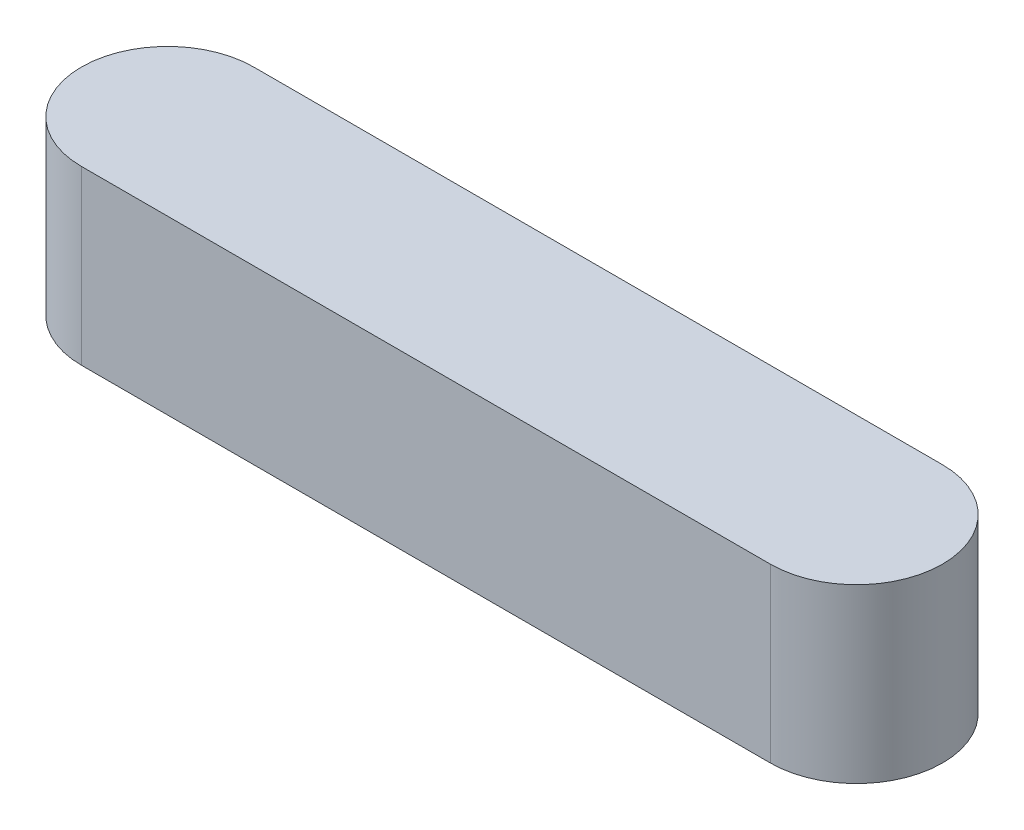
ISO-10303-21;
HEADER;
FILE_DESCRIPTION(('STEP AP214'),'2;1');
FILE_NAME('part.step','',(''),(''),'','','');
FILE_SCHEMA(('AUTOMOTIVE_DESIGN { 1 0 10303 214 1 1 1 1 }'));
ENDSEC;
DATA;
#1=APPLICATION_CONTEXT('core data for automotive mechanical design processes');
#2=APPLICATION_PROTOCOL_DEFINITION('international standard','automotive_design',2000,#1);
#3=PRODUCT_CONTEXT('',#1,'mechanical');
#4=PRODUCT('Part','Part','',(#3));
#5=PRODUCT_RELATED_PRODUCT_CATEGORY('part','',(#4));
#6=PRODUCT_DEFINITION_FORMATION('','',#4);
#7=PRODUCT_DEFINITION_CONTEXT('part definition',#1,'design');
#8=PRODUCT_DEFINITION('design','',#6,#7);
#9=PRODUCT_DEFINITION_SHAPE('','',#8);
#10=(LENGTH_UNIT() NAMED_UNIT(*) SI_UNIT(.MILLI.,.METRE.));
#11=(NAMED_UNIT(*) PLANE_ANGLE_UNIT() SI_UNIT($,.RADIAN.));
#12=(NAMED_UNIT(*) SI_UNIT($,.STERADIAN.) SOLID_ANGLE_UNIT());
#13=UNCERTAINTY_MEASURE_WITH_UNIT(LENGTH_MEASURE(1.E-05),#10,'distance_accuracy_value','');
#14=(GEOMETRIC_REPRESENTATION_CONTEXT(3) GLOBAL_UNCERTAINTY_ASSIGNED_CONTEXT((#13)) GLOBAL_UNIT_ASSIGNED_CONTEXT((#10,
#11,#12)) REPRESENTATION_CONTEXT('',''));
#15=CARTESIAN_POINT('',(0.,0.,0.));
#16=DIRECTION('',(0.,0.,1.));
#17=DIRECTION('',(1.,0.,0.));
#18=AXIS2_PLACEMENT_3D('',#15,#16,#17);
#19=CARTESIAN_POINT('',(-4.,1.,0.));
#20=DIRECTION('',(0.,-1.,0.));
#21=DIRECTION('',(0.,0.,-1.));
#22=AXIS2_PLACEMENT_3D('',#19,#20,#21);
#23=CYLINDRICAL_SURFACE('',#22,1.);
#24=CARTESIAN_POINT('',(-4.,-1.,0.));
#25=DIRECTION('',(0.,1.,0.));
#26=DIRECTION('',(0.,0.,1.));
#27=AXIS2_PLACEMENT_3D('',#24,#25,#26);
#28=CIRCLE('',#27,1.);
#29=CARTESIAN_POINT('',(-4.,-1.,-1.));
#30=VERTEX_POINT('',#29);
#31=CARTESIAN_POINT('',(-4.,-1.,1.));
#32=VERTEX_POINT('',#31);
#33=EDGE_CURVE('E99',#30,#32,#28,.T.);
#34=ORIENTED_EDGE('',*,*,#33,.T.);
#35=DIRECTION('',(0.,-1.,0.));
#36=VECTOR('',#35,1.);
#37=CARTESIAN_POINT('',(-4.,1.,1.));
#38=LINE('',#37,#36);
#39=CARTESIAN_POINT('',(-4.,1.,1.));
#40=VERTEX_POINT('',#39);
#41=EDGE_CURVE('E11',#40,#32,#38,.T.);
#42=ORIENTED_EDGE('',*,*,#41,.F.);
#43=CARTESIAN_POINT('',(-4.,1.,0.));
#44=DIRECTION('',(0.,1.,0.));
#45=DIRECTION('',(0.,0.,1.));
#46=AXIS2_PLACEMENT_3D('',#43,#44,#45);
#47=CIRCLE('',#46,1.);
#48=CARTESIAN_POINT('',(-4.,1.,-1.));
#49=VERTEX_POINT('',#48);
#50=EDGE_CURVE('E87',#49,#40,#47,.T.);
#51=ORIENTED_EDGE('',*,*,#50,.F.);
#52=DIRECTION('',(0.,-1.,0.));
#53=VECTOR('',#52,1.);
#54=CARTESIAN_POINT('',(-4.,1.,-1.));
#55=LINE('',#54,#53);
#56=EDGE_CURVE('E95',#49,#30,#55,.T.);
#57=ORIENTED_EDGE('',*,*,#56,.T.);
#58=EDGE_LOOP('',(#34,#42,#51,#57));
#59=FACE_BOUND('',#58,.T.);
#60=ADVANCED_FACE('F36',(#59),#23,.T.);
#61=CARTESIAN_POINT('',(-4.,1.,1.));
#62=DIRECTION('',(0.,0.,-1.));
#63=DIRECTION('',(-1.,0.,0.));
#64=AXIS2_PLACEMENT_3D('',#61,#62,#63);
#65=PLANE('',#64);
#66=DIRECTION('',(1.,0.,0.));
#67=VECTOR('',#66,1.);
#68=CARTESIAN_POINT('',(-4.,-1.,1.));
#69=LINE('',#68,#67);
#70=CARTESIAN_POINT('',(4.,-1.,1.));
#71=VERTEX_POINT('',#70);
#72=EDGE_CURVE('E91',#32,#71,#69,.T.);
#73=ORIENTED_EDGE('',*,*,#72,.T.);
#74=DIRECTION('',(0.,-1.,0.));
#75=VECTOR('',#74,1.);
#76=CARTESIAN_POINT('',(4.,1.,1.));
#77=LINE('',#76,#75);
#78=CARTESIAN_POINT('',(4.,1.,1.));
#79=VERTEX_POINT('',#78);
#80=EDGE_CURVE('E44',#79,#71,#77,.T.);
#81=ORIENTED_EDGE('',*,*,#80,.F.);
#82=DIRECTION('',(1.,0.,0.));
#83=VECTOR('',#82,1.);
#84=CARTESIAN_POINT('',(-4.,1.,1.));
#85=LINE('',#84,#83);
#86=EDGE_CURVE('E82',#40,#79,#85,.T.);
#87=ORIENTED_EDGE('',*,*,#86,.F.);
#88=ORIENTED_EDGE('',*,*,#41,.T.);
#89=EDGE_LOOP('',(#73,#81,#87,#88));
#90=FACE_BOUND('',#89,.T.);
#91=ADVANCED_FACE('F90',(#90),#65,.F.);
#92=CARTESIAN_POINT('',(4.,1.,0.));
#93=DIRECTION('',(0.,-1.,0.));
#94=DIRECTION('',(0.,0.,-1.));
#95=AXIS2_PLACEMENT_3D('',#92,#93,#94);
#96=CYLINDRICAL_SURFACE('',#95,1.);
#97=CARTESIAN_POINT('',(4.,-1.,0.));
#98=DIRECTION('',(0.,1.,0.));
#99=DIRECTION('',(0.,0.,1.));
#100=AXIS2_PLACEMENT_3D('',#97,#98,#99);
#101=CIRCLE('',#100,1.);
#102=CARTESIAN_POINT('',(4.,-1.,-1.));
#103=VERTEX_POINT('',#102);
#104=EDGE_CURVE('E69',#71,#103,#101,.T.);
#105=ORIENTED_EDGE('',*,*,#104,.T.);
#106=DIRECTION('',(0.,-1.,0.));
#107=VECTOR('',#106,1.);
#108=CARTESIAN_POINT('',(4.,1.,-1.));
#109=LINE('',#108,#107);
#110=CARTESIAN_POINT('',(4.,1.,-1.));
#111=VERTEX_POINT('',#110);
#112=EDGE_CURVE('E92',#111,#103,#109,.T.);
#113=ORIENTED_EDGE('',*,*,#112,.F.);
#114=CARTESIAN_POINT('',(4.,1.,0.));
#115=DIRECTION('',(0.,1.,0.));
#116=DIRECTION('',(0.,0.,1.));
#117=AXIS2_PLACEMENT_3D('',#114,#115,#116);
#118=CIRCLE('',#117,1.);
#119=EDGE_CURVE('E85',#79,#111,#118,.T.);
#120=ORIENTED_EDGE('',*,*,#119,.F.);
#121=ORIENTED_EDGE('',*,*,#80,.T.);
#122=EDGE_LOOP('',(#105,#113,#120,#121));
#123=FACE_BOUND('',#122,.T.);
#124=ADVANCED_FACE('F93',(#123),#96,.T.);
#125=CARTESIAN_POINT('',(-4.,1.,-1.));
#126=DIRECTION('',(0.,0.,1.));
#127=DIRECTION('',(1.,0.,0.));
#128=AXIS2_PLACEMENT_3D('',#125,#126,#127);
#129=PLANE('',#128);
#130=DIRECTION('',(-1.,0.,0.));
#131=VECTOR('',#130,1.);
#132=CARTESIAN_POINT('',(-4.,-1.,-1.));
#133=LINE('',#132,#131);
#134=EDGE_CURVE('E75',#103,#30,#133,.T.);
#135=ORIENTED_EDGE('',*,*,#134,.T.);
#136=ORIENTED_EDGE('',*,*,#56,.F.);
#137=DIRECTION('',(-1.,0.,0.));
#138=VECTOR('',#137,1.);
#139=CARTESIAN_POINT('',(-4.,1.,-1.));
#140=LINE('',#139,#138);
#141=EDGE_CURVE('E52',#111,#49,#140,.T.);
#142=ORIENTED_EDGE('',*,*,#141,.F.);
#143=ORIENTED_EDGE('',*,*,#112,.T.);
#144=EDGE_LOOP('',(#135,#136,#142,#143));
#145=FACE_BOUND('',#144,.T.);
#146=ADVANCED_FACE('F106',(#145),#129,.F.);
#147=CARTESIAN_POINT('',(-4.,1.,0.));
#148=DIRECTION('',(0.,1.,0.));
#149=DIRECTION('',(0.,0.,1.));
#150=AXIS2_PLACEMENT_3D('',#147,#148,#149);
#151=PLANE('',#150);
#152=ORIENTED_EDGE('',*,*,#50,.T.);
#153=ORIENTED_EDGE('',*,*,#86,.T.);
#154=ORIENTED_EDGE('',*,*,#119,.T.);
#155=ORIENTED_EDGE('',*,*,#141,.T.);
#156=EDGE_LOOP('',(#152,#153,#154,#155));
#157=FACE_BOUND('',#156,.T.);
#158=ADVANCED_FACE('F83',(#157),#151,.T.);
#159=CARTESIAN_POINT('',(-4.,-1.,0.));
#160=DIRECTION('',(0.,1.,0.));
#161=DIRECTION('',(0.,0.,1.));
#162=AXIS2_PLACEMENT_3D('',#159,#160,#161);
#163=PLANE('',#162);
#164=ORIENTED_EDGE('',*,*,#33,.F.);
#165=ORIENTED_EDGE('',*,*,#134,.F.);
#166=ORIENTED_EDGE('',*,*,#104,.F.);
#167=ORIENTED_EDGE('',*,*,#72,.F.);
#168=EDGE_LOOP('',(#164,#165,#166,#167));
#169=FACE_BOUND('',#168,.T.);
#170=ADVANCED_FACE('F109',(#169),#163,.F.);
#171=CLOSED_SHELL('',(#60,#91,#124,#146,#158,#170));
#172=MANIFOLD_SOLID_BREP('B2',#171);
#173=ADVANCED_BREP_SHAPE_REPRESENTATION('',(#18,#172),#14);
#174=SHAPE_DEFINITION_REPRESENTATION(#9,#173);
ENDSEC;
END-ISO-10303-21;
